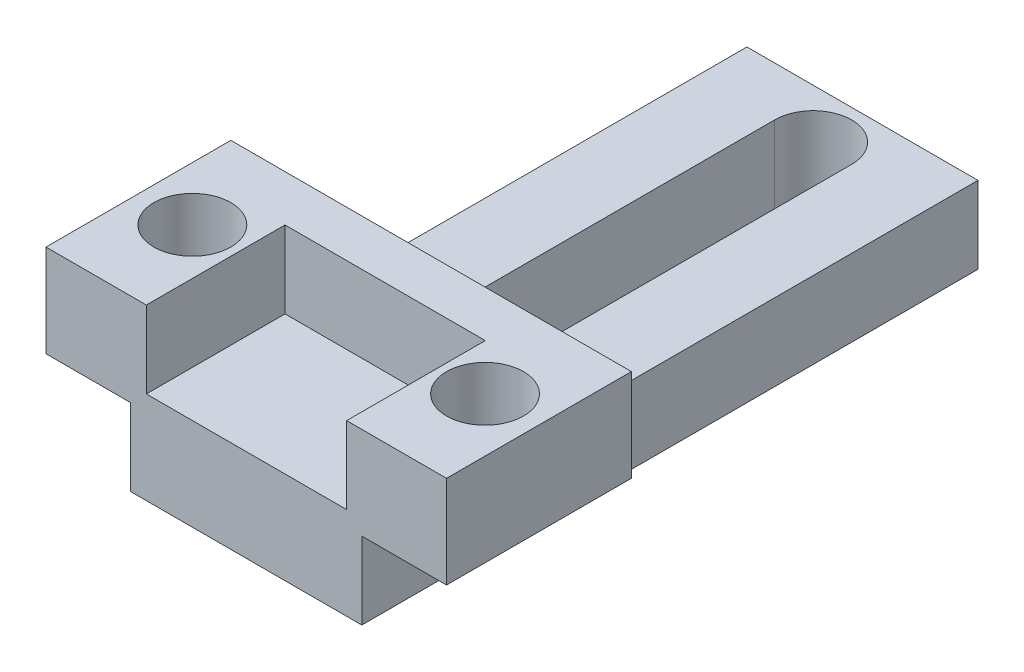
ISO-10303-21;
HEADER;
FILE_DESCRIPTION(('STEP AP214'),'2;1');
FILE_NAME('part.step','',(''),(''),'','','');
FILE_SCHEMA(('AUTOMOTIVE_DESIGN { 1 0 10303 214 1 1 1 1 }'));
ENDSEC;
DATA;
#1=APPLICATION_CONTEXT('core data for automotive mechanical design processes');
#2=APPLICATION_PROTOCOL_DEFINITION('international standard','automotive_design',2000,#1);
#3=PRODUCT_CONTEXT('',#1,'mechanical');
#4=PRODUCT('Part','Part','',(#3));
#5=PRODUCT_RELATED_PRODUCT_CATEGORY('part','',(#4));
#6=PRODUCT_DEFINITION_FORMATION('','',#4);
#7=PRODUCT_DEFINITION_CONTEXT('part definition',#1,'design');
#8=PRODUCT_DEFINITION('design','',#6,#7);
#9=PRODUCT_DEFINITION_SHAPE('','',#8);
#10=(LENGTH_UNIT() NAMED_UNIT(*) SI_UNIT(.MILLI.,.METRE.));
#11=(NAMED_UNIT(*) PLANE_ANGLE_UNIT() SI_UNIT($,.RADIAN.));
#12=(NAMED_UNIT(*) SI_UNIT($,.STERADIAN.) SOLID_ANGLE_UNIT());
#13=UNCERTAINTY_MEASURE_WITH_UNIT(LENGTH_MEASURE(1.E-05),#10,'distance_accuracy_value','');
#14=(GEOMETRIC_REPRESENTATION_CONTEXT(3) GLOBAL_UNCERTAINTY_ASSIGNED_CONTEXT((#13)) GLOBAL_UNIT_ASSIGNED_CONTEXT((#10,
#11,#12)) REPRESENTATION_CONTEXT('',''));
#15=CARTESIAN_POINT('',(0.,0.,0.));
#16=DIRECTION('',(0.,0.,1.));
#17=DIRECTION('',(1.,0.,0.));
#18=AXIS2_PLACEMENT_3D('',#15,#16,#17);
#19=CARTESIAN_POINT('',(0.,5.,0.));
#20=DIRECTION('',(0.,-1.,0.));
#21=DIRECTION('',(0.,0.,-1.));
#22=AXIS2_PLACEMENT_3D('',#19,#20,#21);
#23=PLANE('',#22);
#24=DIRECTION('',(0.,0.,1.));
#25=VECTOR('',#24,1.);
#26=CARTESIAN_POINT('',(-7.5,5.,-20.));
#27=LINE('',#26,#25);
#28=CARTESIAN_POINT('',(-7.5,5.,12.5));
#29=VERTEX_POINT('',#28);
#30=CARTESIAN_POINT('',(-7.5,5.,15.5));
#31=VERTEX_POINT('',#30);
#32=EDGE_CURVE('E340',#29,#31,#27,.T.);
#33=ORIENTED_EDGE('',*,*,#32,.T.);
#34=CARTESIAN_POINT('',(-9.49999999999999,5.,14.));
#35=DIRECTION('',(0.,1.,0.));
#36=DIRECTION('',(0.,0.,1.));
#37=AXIS2_PLACEMENT_3D('',#34,#35,#36);
#38=CIRCLE('',#37,2.5);
#39=EDGE_CURVE('E222',#31,#29,#38,.T.);
#40=ORIENTED_EDGE('',*,*,#39,.T.);
#41=EDGE_LOOP('',(#33,#40));
#42=FACE_BOUND('',#41,.T.);
#43=ADVANCED_FACE('F33',(#42),#23,.F.);
#44=DIRECTION('',(0.,0.,-1.));
#45=VECTOR('',#44,1.);
#46=CARTESIAN_POINT('',(7.5,5.,-20.));
#47=LINE('',#46,#45);
#48=CARTESIAN_POINT('',(7.5,5.,15.5));
#49=VERTEX_POINT('',#48);
#50=CARTESIAN_POINT('',(7.5,5.,12.5));
#51=VERTEX_POINT('',#50);
#52=EDGE_CURVE('E303',#49,#51,#47,.T.);
#53=ORIENTED_EDGE('',*,*,#52,.T.);
#54=CARTESIAN_POINT('',(9.50000000000001,5.,14.));
#55=DIRECTION('',(0.,1.,0.));
#56=DIRECTION('',(0.,0.,-1.));
#57=AXIS2_PLACEMENT_3D('',#54,#55,#56);
#58=CIRCLE('',#57,2.5);
#59=EDGE_CURVE('E215',#51,#49,#58,.T.);
#60=ORIENTED_EDGE('',*,*,#59,.T.);
#61=EDGE_LOOP('',(#53,#60));
#62=FACE_BOUND('',#61,.T.);
#63=ADVANCED_FACE('F365',(#62),#23,.F.);
#64=DIRECTION('',(-1.,0.,0.));
#65=VECTOR('',#64,1.);
#66=CARTESIAN_POINT('',(13.,5.,8.00000000000001));
#67=LINE('',#66,#65);
#68=CARTESIAN_POINT('',(7.5,5.,8.00000000000001));
#69=VERTEX_POINT('',#68);
#70=CARTESIAN_POINT('',(2.50000000000001,5.,8.00000000000001));
#71=VERTEX_POINT('',#70);
#72=EDGE_CURVE('E11',#69,#71,#67,.T.);
#73=ORIENTED_EDGE('',*,*,#72,.F.);
#74=CARTESIAN_POINT('',(7.5,5.,-20.));
#75=VERTEX_POINT('',#74);
#76=EDGE_CURVE('E297',#69,#75,#47,.T.);
#77=ORIENTED_EDGE('',*,*,#76,.T.);
#78=DIRECTION('',(-1.,0.,0.));
#79=VECTOR('',#78,1.);
#80=CARTESIAN_POINT('',(7.5,5.,-20.));
#81=LINE('',#80,#79);
#82=CARTESIAN_POINT('',(-7.5,5.,-20.));
#83=VERTEX_POINT('',#82);
#84=EDGE_CURVE('E302',#75,#83,#81,.T.);
#85=ORIENTED_EDGE('',*,*,#84,.T.);
#86=CARTESIAN_POINT('',(-7.49999999999998,5.,8.00000000000001));
#87=VERTEX_POINT('',#86);
#88=EDGE_CURVE('E294',#83,#87,#27,.T.);
#89=ORIENTED_EDGE('',*,*,#88,.T.);
#90=CARTESIAN_POINT('',(-2.49999999999999,5.,8.00000000000001));
#91=VERTEX_POINT('',#90);
#92=EDGE_CURVE('E42',#91,#87,#67,.T.);
#93=ORIENTED_EDGE('',*,*,#92,.F.);
#94=DIRECTION('',(0.,0.,1.));
#95=VECTOR('',#94,1.);
#96=CARTESIAN_POINT('',(-2.5,5.,-16.79930941898));
#97=LINE('',#96,#95);
#98=CARTESIAN_POINT('',(-2.5,5.,-16.79930941898));
#99=VERTEX_POINT('',#98);
#100=EDGE_CURVE('E263',#99,#91,#97,.T.);
#101=ORIENTED_EDGE('',*,*,#100,.F.);
#102=CARTESIAN_POINT('',(0.,5.,-16.79930941898));
#103=DIRECTION('',(0.,1.,0.));
#104=DIRECTION('',(0.,0.,1.));
#105=AXIS2_PLACEMENT_3D('',#102,#103,#104);
#106=CIRCLE('',#105,2.5);
#107=CARTESIAN_POINT('',(2.5,5.,-16.79930941898));
#108=VERTEX_POINT('',#107);
#109=EDGE_CURVE('E259',#108,#99,#106,.T.);
#110=ORIENTED_EDGE('',*,*,#109,.F.);
#111=DIRECTION('',(0.,0.,-1.));
#112=VECTOR('',#111,1.);
#113=CARTESIAN_POINT('',(2.5,5.,-16.79930941898));
#114=LINE('',#113,#112);
#115=EDGE_CURVE('E269',#71,#108,#114,.T.);
#116=ORIENTED_EDGE('',*,*,#115,.F.);
#117=EDGE_LOOP('',(#73,#77,#85,#89,#93,#101,#110,#116));
#118=FACE_BOUND('',#117,.T.);
#119=ADVANCED_FACE('F344',(#118),#23,.F.);
#120=CARTESIAN_POINT('',(0.,0.,0.));
#121=DIRECTION('',(0.,-1.,0.));
#122=DIRECTION('',(0.,0.,-1.));
#123=AXIS2_PLACEMENT_3D('',#120,#121,#122);
#124=PLANE('',#123);
#125=DIRECTION('',(0.,0.,1.));
#126=VECTOR('',#125,1.);
#127=CARTESIAN_POINT('',(-7.5,0.,-20.));
#128=LINE('',#127,#126);
#129=CARTESIAN_POINT('',(-7.5,0.,-20.));
#130=VERTEX_POINT('',#129);
#131=CARTESIAN_POINT('',(-7.5,0.,20.));
#132=VERTEX_POINT('',#131);
#133=EDGE_CURVE('E293',#130,#132,#128,.T.);
#134=ORIENTED_EDGE('',*,*,#133,.F.);
#135=DIRECTION('',(-1.,0.,0.));
#136=VECTOR('',#135,1.);
#137=CARTESIAN_POINT('',(7.5,0.,-20.));
#138=LINE('',#137,#136);
#139=CARTESIAN_POINT('',(7.5,0.,-20.));
#140=VERTEX_POINT('',#139);
#141=EDGE_CURVE('E312',#140,#130,#138,.T.);
#142=ORIENTED_EDGE('',*,*,#141,.F.);
#143=DIRECTION('',(0.,0.,-1.));
#144=VECTOR('',#143,1.);
#145=CARTESIAN_POINT('',(7.5,0.,-20.));
#146=LINE('',#145,#144);
#147=CARTESIAN_POINT('',(7.5,0.,20.));
#148=VERTEX_POINT('',#147);
#149=EDGE_CURVE('E310',#148,#140,#146,.T.);
#150=ORIENTED_EDGE('',*,*,#149,.F.);
#151=DIRECTION('',(1.,0.,0.));
#152=VECTOR('',#151,1.);
#153=CARTESIAN_POINT('',(7.5,0.,20.));
#154=LINE('',#153,#152);
#155=EDGE_CURVE('E308',#132,#148,#154,.T.);
#156=ORIENTED_EDGE('',*,*,#155,.F.);
#157=EDGE_LOOP('',(#134,#142,#150,#156));
#158=FACE_BOUND('',#157,.T.);
#159=DIRECTION('',(0.,0.,-1.));
#160=VECTOR('',#159,1.);
#161=CARTESIAN_POINT('',(2.5,0.,-16.79930941898));
#162=LINE('',#161,#160);
#163=CARTESIAN_POINT('',(2.50000000000001,0.,11.70069058102));
#164=VERTEX_POINT('',#163);
#165=CARTESIAN_POINT('',(2.5,0.,-16.79930941898));
#166=VERTEX_POINT('',#165);
#167=EDGE_CURVE('E262',#164,#166,#162,.T.);
#168=ORIENTED_EDGE('',*,*,#167,.T.);
#169=CARTESIAN_POINT('',(0.,0.,-16.79930941898));
#170=DIRECTION('',(0.,1.,0.));
#171=DIRECTION('',(0.,0.,1.));
#172=AXIS2_PLACEMENT_3D('',#169,#170,#171);
#173=CIRCLE('',#172,2.5);
#174=CARTESIAN_POINT('',(-2.5,0.,-16.79930941898));
#175=VERTEX_POINT('',#174);
#176=EDGE_CURVE('E258',#166,#175,#173,.T.);
#177=ORIENTED_EDGE('',*,*,#176,.T.);
#178=DIRECTION('',(0.,0.,1.));
#179=VECTOR('',#178,1.);
#180=CARTESIAN_POINT('',(-2.5,0.,-16.79930941898));
#181=LINE('',#180,#179);
#182=CARTESIAN_POINT('',(-2.5,0.,11.70069058102));
#183=VERTEX_POINT('',#182);
#184=EDGE_CURVE('E276',#175,#183,#181,.T.);
#185=ORIENTED_EDGE('',*,*,#184,.T.);
#186=CARTESIAN_POINT('',(0.,0.,11.70069058102));
#187=DIRECTION('',(0.,1.,0.));
#188=DIRECTION('',(0.,0.,1.));
#189=AXIS2_PLACEMENT_3D('',#186,#187,#188);
#190=CIRCLE('',#189,2.5);
#191=EDGE_CURVE('E279',#183,#164,#190,.T.);
#192=ORIENTED_EDGE('',*,*,#191,.T.);
#193=EDGE_LOOP('',(#168,#177,#185,#192));
#194=FACE_BOUND('',#193,.T.);
#195=ADVANCED_FACE('F354',(#158,#194),#124,.T.);
#196=CARTESIAN_POINT('',(-7.5,5.,-20.));
#197=DIRECTION('',(1.,0.,0.));
#198=DIRECTION('',(0.,0.,-1.));
#199=AXIS2_PLACEMENT_3D('',#196,#197,#198);
#200=PLANE('',#199);
#201=ORIENTED_EDGE('',*,*,#133,.T.);
#202=DIRECTION('',(0.,-1.,0.));
#203=VECTOR('',#202,1.);
#204=CARTESIAN_POINT('',(-7.5,5.,20.));
#205=LINE('',#204,#203);
#206=CARTESIAN_POINT('',(-7.49999999999999,5.,20.));
#207=VERTEX_POINT('',#206);
#208=EDGE_CURVE('E37',#207,#132,#205,.T.);
#209=ORIENTED_EDGE('',*,*,#208,.F.);
#210=EDGE_CURVE('E299',#31,#207,#27,.T.);
#211=ORIENTED_EDGE('',*,*,#210,.F.);
#212=ORIENTED_EDGE('',*,*,#32,.F.);
#213=EDGE_CURVE('E298',#87,#29,#27,.T.);
#214=ORIENTED_EDGE('',*,*,#213,.F.);
#215=ORIENTED_EDGE('',*,*,#88,.F.);
#216=DIRECTION('',(0.,-1.,0.));
#217=VECTOR('',#216,1.);
#218=CARTESIAN_POINT('',(-7.5,5.,-20.));
#219=LINE('',#218,#217);
#220=EDGE_CURVE('E305',#83,#130,#219,.T.);
#221=ORIENTED_EDGE('',*,*,#220,.T.);
#222=EDGE_LOOP('',(#201,#209,#211,#212,#214,#215,#221));
#223=FACE_BOUND('',#222,.T.);
#224=ADVANCED_FACE('F35',(#223),#200,.F.);
#225=CARTESIAN_POINT('',(7.5,5.,20.));
#226=DIRECTION('',(0.,0.,-1.));
#227=DIRECTION('',(-1.,0.,0.));
#228=AXIS2_PLACEMENT_3D('',#225,#226,#227);
#229=PLANE('',#228);
#230=DIRECTION('',(1.,0.,0.));
#231=VECTOR('',#230,1.);
#232=CARTESIAN_POINT('',(-6.48450819756823,6.,20.));
#233=LINE('',#232,#231);
#234=CARTESIAN_POINT('',(-6.48450819756823,6.,20.));
#235=VERTEX_POINT('',#234);
#236=CARTESIAN_POINT('',(6.51549180243177,6.,20.));
#237=VERTEX_POINT('',#236);
#238=EDGE_CURVE('E190',#235,#237,#233,.T.);
#239=ORIENTED_EDGE('',*,*,#238,.F.);
#240=DIRECTION('',(0.,1.,0.));
#241=VECTOR('',#240,1.);
#242=CARTESIAN_POINT('',(-6.48450819756823,6.,20.));
#243=LINE('',#242,#241);
#244=CARTESIAN_POINT('',(-6.48450819756823,11.,20.));
#245=VERTEX_POINT('',#244);
#246=EDGE_CURVE('E174',#235,#245,#243,.T.);
#247=ORIENTED_EDGE('',*,*,#246,.T.);
#248=DIRECTION('',(1.,0.,0.));
#249=VECTOR('',#248,1.);
#250=CARTESIAN_POINT('',(13.,11.,20.));
#251=LINE('',#250,#249);
#252=CARTESIAN_POINT('',(-13.,11.,20.));
#253=VERTEX_POINT('',#252);
#254=EDGE_CURVE('E230',#253,#245,#251,.T.);
#255=ORIENTED_EDGE('',*,*,#254,.F.);
#256=DIRECTION('',(0.,-1.,0.));
#257=VECTOR('',#256,1.);
#258=CARTESIAN_POINT('',(-13.,11.,20.));
#259=LINE('',#258,#257);
#260=CARTESIAN_POINT('',(-13.,5.,20.));
#261=VERTEX_POINT('',#260);
#262=EDGE_CURVE('E255',#253,#261,#259,.T.);
#263=ORIENTED_EDGE('',*,*,#262,.T.);
#264=DIRECTION('',(1.,0.,0.));
#265=VECTOR('',#264,1.);
#266=CARTESIAN_POINT('',(13.,5.,20.));
#267=LINE('',#266,#265);
#268=EDGE_CURVE('E240',#261,#207,#267,.T.);
#269=ORIENTED_EDGE('',*,*,#268,.T.);
#270=ORIENTED_EDGE('',*,*,#208,.T.);
#271=ORIENTED_EDGE('',*,*,#155,.T.);
#272=DIRECTION('',(0.,-1.,0.));
#273=VECTOR('',#272,1.);
#274=CARTESIAN_POINT('',(7.5,5.,20.));
#275=LINE('',#274,#273);
#276=CARTESIAN_POINT('',(7.5,5.,20.));
#277=VERTEX_POINT('',#276);
#278=EDGE_CURVE('E318',#277,#148,#275,.T.);
#279=ORIENTED_EDGE('',*,*,#278,.F.);
#280=CARTESIAN_POINT('',(13.,5.,20.));
#281=VERTEX_POINT('',#280);
#282=EDGE_CURVE('E239',#277,#281,#267,.T.);
#283=ORIENTED_EDGE('',*,*,#282,.T.);
#284=DIRECTION('',(0.,-1.,0.));
#285=VECTOR('',#284,1.);
#286=CARTESIAN_POINT('',(13.,11.,20.));
#287=LINE('',#286,#285);
#288=CARTESIAN_POINT('',(13.,11.,20.));
#289=VERTEX_POINT('',#288);
#290=EDGE_CURVE('E252',#289,#281,#287,.T.);
#291=ORIENTED_EDGE('',*,*,#290,.F.);
#292=CARTESIAN_POINT('',(6.51549180243177,11.,20.));
#293=VERTEX_POINT('',#292);
#294=EDGE_CURVE('E228',#293,#289,#251,.T.);
#295=ORIENTED_EDGE('',*,*,#294,.F.);
#296=DIRECTION('',(0.,1.,0.));
#297=VECTOR('',#296,1.);
#298=CARTESIAN_POINT('',(6.51549180243177,6.,20.));
#299=LINE('',#298,#297);
#300=EDGE_CURVE('E51',#237,#293,#299,.T.);
#301=ORIENTED_EDGE('',*,*,#300,.F.);
#302=EDGE_LOOP('',(#239,#247,#255,#263,#269,#270,#271,#279,#283,#291,#295,#301));
#303=FACE_BOUND('',#302,.T.);
#304=ADVANCED_FACE('F194',(#303),#229,.F.);
#305=CARTESIAN_POINT('',(7.5,5.,-20.));
#306=DIRECTION('',(-1.,0.,0.));
#307=DIRECTION('',(0.,0.,1.));
#308=AXIS2_PLACEMENT_3D('',#305,#306,#307);
#309=PLANE('',#308);
#310=ORIENTED_EDGE('',*,*,#149,.T.);
#311=DIRECTION('',(0.,-1.,0.));
#312=VECTOR('',#311,1.);
#313=CARTESIAN_POINT('',(7.5,5.,-20.));
#314=LINE('',#313,#312);
#315=EDGE_CURVE('E316',#75,#140,#314,.T.);
#316=ORIENTED_EDGE('',*,*,#315,.F.);
#317=ORIENTED_EDGE('',*,*,#76,.F.);
#318=EDGE_CURVE('E367',#51,#69,#47,.T.);
#319=ORIENTED_EDGE('',*,*,#318,.F.);
#320=ORIENTED_EDGE('',*,*,#52,.F.);
#321=EDGE_CURVE('E300',#277,#49,#47,.T.);
#322=ORIENTED_EDGE('',*,*,#321,.F.);
#323=ORIENTED_EDGE('',*,*,#278,.T.);
#324=EDGE_LOOP('',(#310,#316,#317,#319,#320,#322,#323));
#325=FACE_BOUND('',#324,.T.);
#326=ADVANCED_FACE('F358',(#325),#309,.F.);
#327=CARTESIAN_POINT('',(7.5,5.,-20.));
#328=DIRECTION('',(0.,0.,1.));
#329=DIRECTION('',(1.,0.,0.));
#330=AXIS2_PLACEMENT_3D('',#327,#328,#329);
#331=PLANE('',#330);
#332=ORIENTED_EDGE('',*,*,#141,.T.);
#333=ORIENTED_EDGE('',*,*,#220,.F.);
#334=ORIENTED_EDGE('',*,*,#84,.F.);
#335=ORIENTED_EDGE('',*,*,#315,.T.);
#336=EDGE_LOOP('',(#332,#333,#334,#335));
#337=FACE_BOUND('',#336,.T.);
#338=ADVANCED_FACE('F350',(#337),#331,.F.);
#339=CARTESIAN_POINT('',(0.,5.,-16.79930941898));
#340=DIRECTION('',(0.,-1.,0.));
#341=DIRECTION('',(0.,0.,-1.));
#342=AXIS2_PLACEMENT_3D('',#339,#340,#341);
#343=CYLINDRICAL_SURFACE('',#342,2.5);
#344=ORIENTED_EDGE('',*,*,#176,.F.);
#345=DIRECTION('',(0.,-1.,0.));
#346=VECTOR('',#345,1.);
#347=CARTESIAN_POINT('',(2.5,5.,-16.79930941898));
#348=LINE('',#347,#346);
#349=EDGE_CURVE('E273',#108,#166,#348,.T.);
#350=ORIENTED_EDGE('',*,*,#349,.F.);
#351=ORIENTED_EDGE('',*,*,#109,.T.);
#352=DIRECTION('',(0.,-1.,0.));
#353=VECTOR('',#352,1.);
#354=CARTESIAN_POINT('',(-2.5,5.,-16.79930941898));
#355=LINE('',#354,#353);
#356=EDGE_CURVE('E290',#99,#175,#355,.T.);
#357=ORIENTED_EDGE('',*,*,#356,.T.);
#358=EDGE_LOOP('',(#344,#350,#351,#357));
#359=FACE_BOUND('',#358,.T.);
#360=ADVANCED_FACE('F389',(#359),#343,.F.);
#361=CARTESIAN_POINT('',(-2.5,5.,-16.79930941898));
#362=DIRECTION('',(1.,0.,0.));
#363=DIRECTION('',(0.,0.,-1.));
#364=AXIS2_PLACEMENT_3D('',#361,#362,#363);
#365=PLANE('',#364);
#366=ORIENTED_EDGE('',*,*,#184,.F.);
#367=ORIENTED_EDGE('',*,*,#356,.F.);
#368=ORIENTED_EDGE('',*,*,#100,.T.);
#369=CARTESIAN_POINT('',(-2.5,5.,11.70069058102));
#370=VERTEX_POINT('',#369);
#371=EDGE_CURVE('E261',#91,#370,#97,.T.);
#372=ORIENTED_EDGE('',*,*,#371,.T.);
#373=DIRECTION('',(0.,-1.,0.));
#374=VECTOR('',#373,1.);
#375=CARTESIAN_POINT('',(-2.5,5.,11.70069058102));
#376=LINE('',#375,#374);
#377=EDGE_CURVE('E288',#370,#183,#376,.T.);
#378=ORIENTED_EDGE('',*,*,#377,.T.);
#379=EDGE_LOOP('',(#366,#367,#368,#372,#378));
#380=FACE_BOUND('',#379,.T.);
#381=ADVANCED_FACE('F383',(#380),#365,.T.);
#382=CARTESIAN_POINT('',(0.,5.,11.70069058102));
#383=DIRECTION('',(0.,-1.,0.));
#384=DIRECTION('',(0.,0.,-1.));
#385=AXIS2_PLACEMENT_3D('',#382,#383,#384);
#386=CYLINDRICAL_SURFACE('',#385,2.5);
#387=ORIENTED_EDGE('',*,*,#191,.F.);
#388=ORIENTED_EDGE('',*,*,#377,.F.);
#389=CARTESIAN_POINT('',(0.,5.,11.70069058102));
#390=DIRECTION('',(0.,1.,0.));
#391=DIRECTION('',(0.,0.,1.));
#392=AXIS2_PLACEMENT_3D('',#389,#390,#391);
#393=CIRCLE('',#392,2.5);
#394=CARTESIAN_POINT('',(2.50000000000001,5.,11.70069058102));
#395=VERTEX_POINT('',#394);
#396=EDGE_CURVE('E266',#370,#395,#393,.T.);
#397=ORIENTED_EDGE('',*,*,#396,.T.);
#398=DIRECTION('',(0.,-1.,0.));
#399=VECTOR('',#398,1.);
#400=CARTESIAN_POINT('',(2.50000000000001,5.,11.70069058102));
#401=LINE('',#400,#399);
#402=EDGE_CURVE('E286',#395,#164,#401,.T.);
#403=ORIENTED_EDGE('',*,*,#402,.T.);
#404=EDGE_LOOP('',(#387,#388,#397,#403));
#405=FACE_BOUND('',#404,.T.);
#406=ADVANCED_FACE('F387',(#405),#386,.F.);
#407=CARTESIAN_POINT('',(2.5,5.,-16.79930941898));
#408=DIRECTION('',(-1.,0.,0.));
#409=DIRECTION('',(0.,0.,1.));
#410=AXIS2_PLACEMENT_3D('',#407,#408,#409);
#411=PLANE('',#410);
#412=ORIENTED_EDGE('',*,*,#167,.F.);
#413=ORIENTED_EDGE('',*,*,#402,.F.);
#414=EDGE_CURVE('E270',#395,#71,#114,.T.);
#415=ORIENTED_EDGE('',*,*,#414,.T.);
#416=ORIENTED_EDGE('',*,*,#115,.T.);
#417=ORIENTED_EDGE('',*,*,#349,.T.);
#418=EDGE_LOOP('',(#412,#413,#415,#416,#417));
#419=FACE_BOUND('',#418,.T.);
#420=ADVANCED_FACE('F377',(#419),#411,.T.);
#421=CARTESIAN_POINT('',(0.,5.,0.));
#422=DIRECTION('',(0.,1.,0.));
#423=DIRECTION('',(0.,0.,1.));
#424=AXIS2_PLACEMENT_3D('',#421,#422,#423);
#425=PLANE('',#424);
#426=CARTESIAN_POINT('',(-13.,5.,8.00000000000001));
#427=VERTEX_POINT('',#426);
#428=EDGE_CURVE('E244',#87,#427,#67,.T.);
#429=ORIENTED_EDGE('',*,*,#428,.F.);
#430=ORIENTED_EDGE('',*,*,#213,.T.);
#431=EDGE_CURVE('E214',#29,#31,#38,.T.);
#432=ORIENTED_EDGE('',*,*,#431,.T.);
#433=ORIENTED_EDGE('',*,*,#210,.T.);
#434=ORIENTED_EDGE('',*,*,#268,.F.);
#435=DIRECTION('',(0.,0.,1.));
#436=VECTOR('',#435,1.);
#437=CARTESIAN_POINT('',(-13.,5.,20.));
#438=LINE('',#437,#436);
#439=EDGE_CURVE('E221',#427,#261,#438,.T.);
#440=ORIENTED_EDGE('',*,*,#439,.F.);
#441=EDGE_LOOP('',(#429,#430,#432,#433,#434,#440));
#442=FACE_BOUND('',#441,.T.);
#443=ADVANCED_FACE('F470',(#442),#425,.F.);
#444=ORIENTED_EDGE('',*,*,#282,.F.);
#445=ORIENTED_EDGE('',*,*,#321,.T.);
#446=EDGE_CURVE('E58',#49,#51,#58,.T.);
#447=ORIENTED_EDGE('',*,*,#446,.T.);
#448=ORIENTED_EDGE('',*,*,#318,.T.);
#449=CARTESIAN_POINT('',(13.,5.,8.00000000000001));
#450=VERTEX_POINT('',#449);
#451=EDGE_CURVE('E229',#450,#69,#67,.T.);
#452=ORIENTED_EDGE('',*,*,#451,.F.);
#453=DIRECTION('',(0.,0.,-1.));
#454=VECTOR('',#453,1.);
#455=CARTESIAN_POINT('',(13.,5.,20.));
#456=LINE('',#455,#454);
#457=EDGE_CURVE('E243',#281,#450,#456,.T.);
#458=ORIENTED_EDGE('',*,*,#457,.F.);
#459=EDGE_LOOP('',(#444,#445,#447,#448,#452,#458));
#460=FACE_BOUND('',#459,.T.);
#461=ADVANCED_FACE('F362',(#460),#425,.F.);
#462=CARTESIAN_POINT('',(0.,11.,0.));
#463=DIRECTION('',(0.,1.,0.));
#464=DIRECTION('',(0.,0.,1.));
#465=AXIS2_PLACEMENT_3D('',#462,#463,#464);
#466=PLANE('',#465);
#467=DIRECTION('',(0.,0.,1.));
#468=VECTOR('',#467,1.);
#469=CARTESIAN_POINT('',(-6.48450819756823,11.,20.));
#470=LINE('',#469,#468);
#471=CARTESIAN_POINT('',(-6.48450819756823,11.,11.));
#472=VERTEX_POINT('',#471);
#473=EDGE_CURVE('E180',#472,#245,#470,.T.);
#474=ORIENTED_EDGE('',*,*,#473,.F.);
#475=DIRECTION('',(-1.,0.,0.));
#476=VECTOR('',#475,1.);
#477=CARTESIAN_POINT('',(-6.48450819756823,11.,11.));
#478=LINE('',#477,#476);
#479=CARTESIAN_POINT('',(6.51549180243177,11.,11.));
#480=VERTEX_POINT('',#479);
#481=EDGE_CURVE('E192',#480,#472,#478,.T.);
#482=ORIENTED_EDGE('',*,*,#481,.F.);
#483=DIRECTION('',(0.,0.,-1.));
#484=VECTOR('',#483,1.);
#485=CARTESIAN_POINT('',(6.51549180243177,11.,20.));
#486=LINE('',#485,#484);
#487=EDGE_CURVE('E202',#293,#480,#486,.T.);
#488=ORIENTED_EDGE('',*,*,#487,.F.);
#489=ORIENTED_EDGE('',*,*,#294,.T.);
#490=DIRECTION('',(0.,0.,-1.));
#491=VECTOR('',#490,1.);
#492=CARTESIAN_POINT('',(13.,11.,20.));
#493=LINE('',#492,#491);
#494=CARTESIAN_POINT('',(13.,11.,8.00000000000001));
#495=VERTEX_POINT('',#494);
#496=EDGE_CURVE('E232',#289,#495,#493,.T.);
#497=ORIENTED_EDGE('',*,*,#496,.T.);
#498=DIRECTION('',(-1.,0.,0.));
#499=VECTOR('',#498,1.);
#500=CARTESIAN_POINT('',(13.,11.,8.00000000000001));
#501=LINE('',#500,#499);
#502=CARTESIAN_POINT('',(-13.,11.,8.00000000000001));
#503=VERTEX_POINT('',#502);
#504=EDGE_CURVE('E234',#495,#503,#501,.T.);
#505=ORIENTED_EDGE('',*,*,#504,.T.);
#506=DIRECTION('',(0.,0.,1.));
#507=VECTOR('',#506,1.);
#508=CARTESIAN_POINT('',(-13.,11.,20.));
#509=LINE('',#508,#507);
#510=EDGE_CURVE('E225',#503,#253,#509,.T.);
#511=ORIENTED_EDGE('',*,*,#510,.T.);
#512=ORIENTED_EDGE('',*,*,#254,.T.);
#513=EDGE_LOOP('',(#474,#482,#488,#489,#497,#505,#511,#512));
#514=FACE_BOUND('',#513,.T.);
#515=CARTESIAN_POINT('',(-9.49999999999999,11.,14.));
#516=DIRECTION('',(0.,1.,0.));
#517=DIRECTION('',(0.,0.,1.));
#518=AXIS2_PLACEMENT_3D('',#515,#516,#517);
#519=CIRCLE('',#518,2.5);
#520=CARTESIAN_POINT('',(-9.49999999999999,11.,16.5));
#521=VERTEX_POINT('',#520);
#522=EDGE_CURVE('E218',#521,#521,#519,.T.);
#523=ORIENTED_EDGE('',*,*,#522,.F.);
#524=EDGE_LOOP('',(#523));
#525=FACE_BOUND('',#524,.T.);
#526=CARTESIAN_POINT('',(9.50000000000001,11.,14.));
#527=DIRECTION('',(0.,1.,0.));
#528=DIRECTION('',(0.,0.,-1.));
#529=AXIS2_PLACEMENT_3D('',#526,#527,#528);
#530=CIRCLE('',#529,2.5);
#531=CARTESIAN_POINT('',(9.50000000000001,11.,11.5));
#532=VERTEX_POINT('',#531);
#533=EDGE_CURVE('E211',#532,#532,#530,.T.);
#534=ORIENTED_EDGE('',*,*,#533,.F.);
#535=EDGE_LOOP('',(#534));
#536=FACE_BOUND('',#535,.T.);
#537=ADVANCED_FACE('F484',(#514,#525,#536),#466,.T.);
#538=ORIENTED_EDGE('',*,*,#414,.F.);
#539=ORIENTED_EDGE('',*,*,#396,.F.);
#540=ORIENTED_EDGE('',*,*,#371,.F.);
#541=EDGE_CURVE('E44',#71,#91,#67,.T.);
#542=ORIENTED_EDGE('',*,*,#541,.F.);
#543=EDGE_LOOP('',(#538,#539,#540,#542));
#544=FACE_BOUND('',#543,.T.);
#545=ADVANCED_FACE('F379',(#544),#425,.F.);
#546=CARTESIAN_POINT('',(-13.,11.,20.));
#547=DIRECTION('',(1.,0.,0.));
#548=DIRECTION('',(0.,0.,-1.));
#549=AXIS2_PLACEMENT_3D('',#546,#547,#548);
#550=PLANE('',#549);
#551=ORIENTED_EDGE('',*,*,#439,.T.);
#552=ORIENTED_EDGE('',*,*,#262,.F.);
#553=ORIENTED_EDGE('',*,*,#510,.F.);
#554=DIRECTION('',(0.,-1.,0.));
#555=VECTOR('',#554,1.);
#556=CARTESIAN_POINT('',(-13.,11.,8.00000000000001));
#557=LINE('',#556,#555);
#558=EDGE_CURVE('E236',#503,#427,#557,.T.);
#559=ORIENTED_EDGE('',*,*,#558,.T.);
#560=EDGE_LOOP('',(#551,#552,#553,#559));
#561=FACE_BOUND('',#560,.T.);
#562=ADVANCED_FACE('F499',(#561),#550,.F.);
#563=CARTESIAN_POINT('',(13.,11.,20.));
#564=DIRECTION('',(-1.,0.,0.));
#565=DIRECTION('',(0.,0.,1.));
#566=AXIS2_PLACEMENT_3D('',#563,#564,#565);
#567=PLANE('',#566);
#568=ORIENTED_EDGE('',*,*,#457,.T.);
#569=DIRECTION('',(0.,-1.,0.));
#570=VECTOR('',#569,1.);
#571=CARTESIAN_POINT('',(13.,11.,8.00000000000001));
#572=LINE('',#571,#570);
#573=EDGE_CURVE('E249',#495,#450,#572,.T.);
#574=ORIENTED_EDGE('',*,*,#573,.F.);
#575=ORIENTED_EDGE('',*,*,#496,.F.);
#576=ORIENTED_EDGE('',*,*,#290,.T.);
#577=EDGE_LOOP('',(#568,#574,#575,#576));
#578=FACE_BOUND('',#577,.T.);
#579=ADVANCED_FACE('F506',(#578),#567,.F.);
#580=CARTESIAN_POINT('',(13.,11.,8.00000000000001));
#581=DIRECTION('',(0.,0.,1.));
#582=DIRECTION('',(1.,0.,0.));
#583=AXIS2_PLACEMENT_3D('',#580,#581,#582);
#584=PLANE('',#583);
#585=ORIENTED_EDGE('',*,*,#451,.T.);
#586=ORIENTED_EDGE('',*,*,#72,.T.);
#587=ORIENTED_EDGE('',*,*,#541,.T.);
#588=ORIENTED_EDGE('',*,*,#92,.T.);
#589=ORIENTED_EDGE('',*,*,#428,.T.);
#590=ORIENTED_EDGE('',*,*,#558,.F.);
#591=ORIENTED_EDGE('',*,*,#504,.F.);
#592=ORIENTED_EDGE('',*,*,#573,.T.);
#593=EDGE_LOOP('',(#585,#586,#587,#588,#589,#590,#591,#592));
#594=FACE_BOUND('',#593,.T.);
#595=ADVANCED_FACE('F331',(#594),#584,.F.);
#596=CARTESIAN_POINT('',(-9.49999999999999,11.,14.));
#597=DIRECTION('',(0.,-1.,0.));
#598=DIRECTION('',(0.,0.,-1.));
#599=AXIS2_PLACEMENT_3D('',#596,#597,#598);
#600=CYLINDRICAL_SURFACE('',#599,2.5);
#601=ORIENTED_EDGE('',*,*,#522,.T.);
#602=EDGE_LOOP('',(#601));
#603=FACE_BOUND('',#602,.T.);
#604=ORIENTED_EDGE('',*,*,#39,.F.);
#605=ORIENTED_EDGE('',*,*,#431,.F.);
#606=EDGE_LOOP('',(#604,#605));
#607=FACE_BOUND('',#606,.T.);
#608=ADVANCED_FACE('F523',(#603,#607),#600,.F.);
#609=CARTESIAN_POINT('',(9.50000000000001,11.,14.));
#610=DIRECTION('',(0.,-1.,0.));
#611=DIRECTION('',(0.,0.,-1.));
#612=AXIS2_PLACEMENT_3D('',#609,#610,#611);
#613=CYLINDRICAL_SURFACE('',#612,2.5);
#614=ORIENTED_EDGE('',*,*,#533,.T.);
#615=EDGE_LOOP('',(#614));
#616=FACE_BOUND('',#615,.T.);
#617=ORIENTED_EDGE('',*,*,#59,.F.);
#618=ORIENTED_EDGE('',*,*,#446,.F.);
#619=EDGE_LOOP('',(#617,#618));
#620=FACE_BOUND('',#619,.T.);
#621=ADVANCED_FACE('F366',(#616,#620),#613,.F.);
#622=CARTESIAN_POINT('',(-6.48450819756823,6.,20.));
#623=DIRECTION('',(-1.,0.,0.));
#624=DIRECTION('',(0.,0.,1.));
#625=AXIS2_PLACEMENT_3D('',#622,#623,#624);
#626=PLANE('',#625);
#627=ORIENTED_EDGE('',*,*,#473,.T.);
#628=ORIENTED_EDGE('',*,*,#246,.F.);
#629=DIRECTION('',(0.,0.,1.));
#630=VECTOR('',#629,1.);
#631=CARTESIAN_POINT('',(-6.48450819756823,6.,20.));
#632=LINE('',#631,#630);
#633=CARTESIAN_POINT('',(-6.48450819756823,6.,11.));
#634=VERTEX_POINT('',#633);
#635=EDGE_CURVE('E177',#634,#235,#632,.T.);
#636=ORIENTED_EDGE('',*,*,#635,.F.);
#637=DIRECTION('',(0.,1.,0.));
#638=VECTOR('',#637,1.);
#639=CARTESIAN_POINT('',(-6.48450819756823,6.,11.));
#640=LINE('',#639,#638);
#641=EDGE_CURVE('E206',#634,#472,#640,.T.);
#642=ORIENTED_EDGE('',*,*,#641,.T.);
#643=EDGE_LOOP('',(#627,#628,#636,#642));
#644=FACE_BOUND('',#643,.T.);
#645=ADVANCED_FACE('F176',(#644),#626,.F.);
#646=CARTESIAN_POINT('',(-6.48450819756823,6.,11.));
#647=DIRECTION('',(0.,0.,-1.));
#648=DIRECTION('',(-1.,0.,0.));
#649=AXIS2_PLACEMENT_3D('',#646,#647,#648);
#650=PLANE('',#649);
#651=ORIENTED_EDGE('',*,*,#481,.T.);
#652=ORIENTED_EDGE('',*,*,#641,.F.);
#653=DIRECTION('',(-1.,0.,0.));
#654=VECTOR('',#653,1.);
#655=CARTESIAN_POINT('',(-6.48450819756823,6.,11.));
#656=LINE('',#655,#654);
#657=CARTESIAN_POINT('',(6.51549180243177,6.,11.));
#658=VERTEX_POINT('',#657);
#659=EDGE_CURVE('E184',#658,#634,#656,.T.);
#660=ORIENTED_EDGE('',*,*,#659,.F.);
#661=DIRECTION('',(0.,1.,0.));
#662=VECTOR('',#661,1.);
#663=CARTESIAN_POINT('',(6.51549180243177,6.,11.));
#664=LINE('',#663,#662);
#665=EDGE_CURVE('E208',#658,#480,#664,.T.);
#666=ORIENTED_EDGE('',*,*,#665,.T.);
#667=EDGE_LOOP('',(#651,#652,#660,#666));
#668=FACE_BOUND('',#667,.T.);
#669=ADVANCED_FACE('F545',(#668),#650,.F.);
#670=CARTESIAN_POINT('',(6.51549180243177,6.,20.));
#671=DIRECTION('',(1.,0.,0.));
#672=DIRECTION('',(0.,0.,-1.));
#673=AXIS2_PLACEMENT_3D('',#670,#671,#672);
#674=PLANE('',#673);
#675=ORIENTED_EDGE('',*,*,#487,.T.);
#676=ORIENTED_EDGE('',*,*,#665,.F.);
#677=DIRECTION('',(0.,0.,-1.));
#678=VECTOR('',#677,1.);
#679=CARTESIAN_POINT('',(6.51549180243177,6.,20.));
#680=LINE('',#679,#678);
#681=EDGE_CURVE('E196',#237,#658,#680,.T.);
#682=ORIENTED_EDGE('',*,*,#681,.F.);
#683=ORIENTED_EDGE('',*,*,#300,.T.);
#684=EDGE_LOOP('',(#675,#676,#682,#683));
#685=FACE_BOUND('',#684,.T.);
#686=ADVANCED_FACE('F553',(#685),#674,.F.);
#687=CARTESIAN_POINT('',(0.,6.,0.));
#688=DIRECTION('',(0.,-1.,0.));
#689=DIRECTION('',(0.,0.,-1.));
#690=AXIS2_PLACEMENT_3D('',#687,#688,#689);
#691=PLANE('',#690);
#692=ORIENTED_EDGE('',*,*,#635,.T.);
#693=ORIENTED_EDGE('',*,*,#238,.T.);
#694=ORIENTED_EDGE('',*,*,#681,.T.);
#695=ORIENTED_EDGE('',*,*,#659,.T.);
#696=EDGE_LOOP('',(#692,#693,#694,#695));
#697=FACE_BOUND('',#696,.T.);
#698=ADVANCED_FACE('F188',(#697),#691,.F.);
#699=CLOSED_SHELL('',(#43,#63,#119,#195,#224,#304,#326,#338,#360,#381,#406,#420,#443,#461,#537,
#545,#562,#579,#595,#608,#621,#645,#669,#686,#698));
#700=MANIFOLD_SOLID_BREP('B2',#699);
#701=ADVANCED_BREP_SHAPE_REPRESENTATION('',(#18,#700),#14);
#702=SHAPE_DEFINITION_REPRESENTATION(#9,#701);
ENDSEC;
END-ISO-10303-21;
